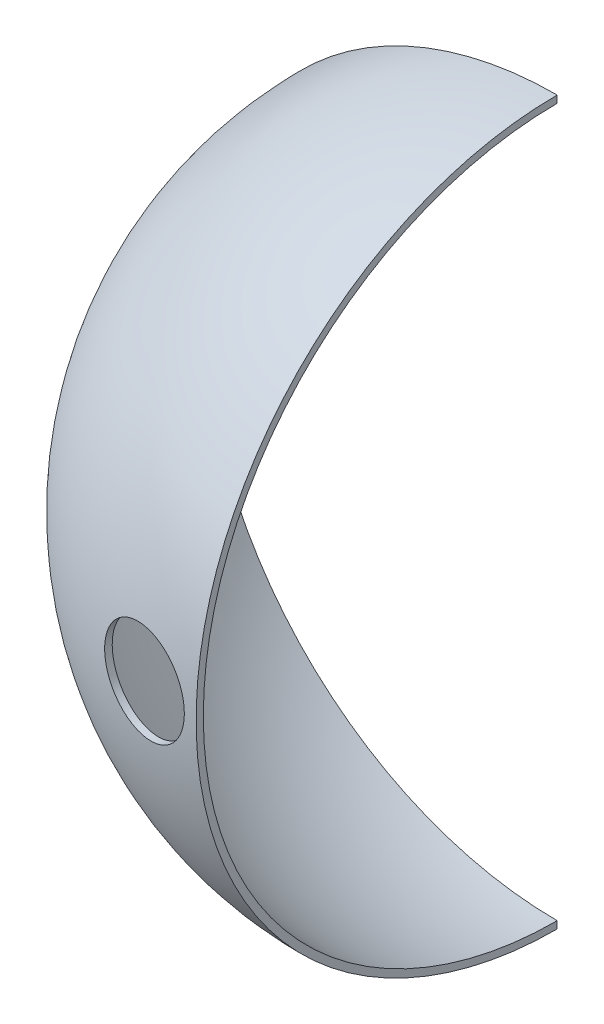
ISO-10303-21;
HEADER;
FILE_DESCRIPTION(('STEP AP214'),'2;1');
FILE_NAME('part.step','',(''),(''),'','','');
FILE_SCHEMA(('AUTOMOTIVE_DESIGN { 1 0 10303 214 1 1 1 1 }'));
ENDSEC;
DATA;
#1=APPLICATION_CONTEXT('core data for automotive mechanical design processes');
#2=APPLICATION_PROTOCOL_DEFINITION('international standard','automotive_design',2000,#1);
#3=PRODUCT_CONTEXT('',#1,'mechanical');
#4=PRODUCT('Part','Part','',(#3));
#5=PRODUCT_RELATED_PRODUCT_CATEGORY('part','',(#4));
#6=PRODUCT_DEFINITION_FORMATION('','',#4);
#7=PRODUCT_DEFINITION_CONTEXT('part definition',#1,'design');
#8=PRODUCT_DEFINITION('design','',#6,#7);
#9=PRODUCT_DEFINITION_SHAPE('','',#8);
#10=(LENGTH_UNIT() NAMED_UNIT(*) SI_UNIT(.MILLI.,.METRE.));
#11=(NAMED_UNIT(*) PLANE_ANGLE_UNIT() SI_UNIT($,.RADIAN.));
#12=(NAMED_UNIT(*) SI_UNIT($,.STERADIAN.) SOLID_ANGLE_UNIT());
#13=UNCERTAINTY_MEASURE_WITH_UNIT(LENGTH_MEASURE(1.E-05),#10,'distance_accuracy_value','');
#14=(GEOMETRIC_REPRESENTATION_CONTEXT(3) GLOBAL_UNCERTAINTY_ASSIGNED_CONTEXT((#13)) GLOBAL_UNIT_ASSIGNED_CONTEXT((#10,
#11,#12)) REPRESENTATION_CONTEXT('',''));
#15=CARTESIAN_POINT('',(0.,0.,0.));
#16=DIRECTION('',(0.,0.,1.));
#17=DIRECTION('',(1.,0.,0.));
#18=AXIS2_PLACEMENT_3D('',#15,#16,#17);
#19=CARTESIAN_POINT('',(0.,0.,0.));
#20=DIRECTION('',(0.,-1.,0.));
#21=DIRECTION('',(-1.,0.,0.));
#22=AXIS2_PLACEMENT_3D('',#19,#20,#21);
#23=SPHERICAL_SURFACE('',#22,150.5);
#24=CARTESIAN_POINT('',(0.,0.,0.));
#25=DIRECTION('',(1.,0.,0.));
#26=DIRECTION('',(0.,0.,-1.));
#27=AXIS2_PLACEMENT_3D('',#24,#25,#26);
#28=CIRCLE('',#27,150.5);
#29=CARTESIAN_POINT('',(0.,150.5,0.));
#30=VERTEX_POINT('',#29);
#31=CARTESIAN_POINT('',(0.,-150.5,0.));
#32=VERTEX_POINT('',#31);
#33=EDGE_CURVE('E50',#30,#32,#28,.T.);
#34=ORIENTED_EDGE('',*,*,#33,.F.);
#35=CARTESIAN_POINT('',(0.,0.,0.));
#36=DIRECTION('',(0.,0.,1.));
#37=DIRECTION('',(1.,0.,0.));
#38=AXIS2_PLACEMENT_3D('',#35,#36,#37);
#39=CIRCLE('',#38,150.5);
#40=EDGE_CURVE('E11',#32,#30,#39,.F.);
#41=ORIENTED_EDGE('',*,*,#40,.F.);
#42=EDGE_LOOP('',(#34,#41));
#43=FACE_BOUND('',#42,.T.);
#44=CARTESIAN_POINT('',(-39.4310487306858,-13.8471958364346,144.581110673095));
#45=CARTESIAN_POINT('',(-39.0381050233485,-14.2567071014734,144.649055865685));
#46=CARTESIAN_POINT('',(-38.6279701786542,-14.6492144025673,144.719925686218));
#47=CARTESIAN_POINT('',(-37.9893487706629,-15.2104314734974,144.830189927499));
#48=CARTESIAN_POINT('',(-37.7725268102766,-15.3929463833361,144.867612346065));
#49=CARTESIAN_POINT('',(-37.331403445921,-15.7485482130627,144.943717616003));
#50=CARTESIAN_POINT('',(-37.1071000890091,-15.9216326396705,144.982400796423));
#51=CARTESIAN_POINT('',(-36.4231935372251,-16.4265614154972,145.100298067775));
#52=CARTESIAN_POINT('',(-35.9529629320937,-16.7437570709808,145.181296155008));
#53=CARTESIAN_POINT('',(-34.9878040589899,-17.3367986437559,145.3474000197));
#54=CARTESIAN_POINT('',(-34.4928756176414,-17.6126442707202,145.432505825996));
#55=CARTESIAN_POINT('',(-33.7349930699175,-17.9938834878905,145.562708931914));
#56=CARTESIAN_POINT('',(-33.4798729584012,-18.1155059882787,145.606518760626));
#57=CARTESIAN_POINT('',(-32.9648920054357,-18.3477591601832,145.694911897753));
#58=CARTESIAN_POINT('',(-32.7050324058151,-18.4583926633953,145.739495003409));
#59=CARTESIAN_POINT('',(-31.9188753559008,-18.7735947314012,145.874309940598));
#60=CARTESIAN_POINT('',(-31.3859620113773,-18.9614837793332,145.96561386001));
#61=CARTESIAN_POINT('',(-30.3067202695832,-19.2913746895618,146.150342177875));
#62=CARTESIAN_POINT('',(-29.7603956179423,-19.4333892106913,146.243765983729));
#63=CARTESIAN_POINT('',(-28.6579314464045,-19.6707252715155,146.432108139113));
#64=CARTESIAN_POINT('',(-28.1017919095298,-19.766046730432,146.52702649123));
#65=CARTESIAN_POINT('',(-26.9789535329713,-19.9099667766591,146.718477236235));
#66=CARTESIAN_POINT('',(-26.4122053737911,-19.9581713697531,146.815016486435));
#67=CARTESIAN_POINT('',(-25.276685145813,-20.0061583357826,147.008248331118));
#68=CARTESIAN_POINT('',(-24.7079130637484,-20.005940390722,147.104940926604));
#69=CARTESIAN_POINT('',(-23.5723194321493,-19.9570725053761,147.297804900283));
#70=CARTESIAN_POINT('',(-23.0054980335153,-19.9084188991269,147.39397623847));
#71=CARTESIAN_POINT('',(-21.8778578192108,-19.7629807821317,147.585115248932));
#72=CARTESIAN_POINT('',(-21.3170390050038,-19.6661962596513,147.680082920913));
#73=CARTESIAN_POINT('',(-20.2035954922698,-19.4247280579177,147.868452095532));
#74=CARTESIAN_POINT('',(-19.6510029777789,-19.2798912101961,147.961847573358));
#75=CARTESIAN_POINT('',(-18.5598408596744,-18.943345138589,148.146098311688));
#76=CARTESIAN_POINT('',(-18.0212713080786,-18.7516357408587,148.236953562769));
#77=CARTESIAN_POINT('',(-16.9620700330992,-18.3226135802604,148.415479203055));
#78=CARTESIAN_POINT('',(-16.4414381081323,-18.0853013300751,148.503149628052));
#79=CARTESIAN_POINT('',(-15.4219237439402,-17.5666601403855,148.674682342639));
#80=CARTESIAN_POINT('',(-14.9230411696594,-17.2853314742571,148.758544655877));
#81=CARTESIAN_POINT('',(-13.9536034865514,-16.6823571503085,148.921376626357));
#82=CARTESIAN_POINT('',(-13.4828981243699,-16.3609601041686,149.000372315798));
#83=CARTESIAN_POINT('',(-12.5701250273682,-15.6787387057272,149.153443163449));
#84=CARTESIAN_POINT('',(-12.1280572300141,-15.3179144395247,149.227518332402));
#85=CARTESIAN_POINT('',(-11.2759035076325,-14.5593460700349,149.370210939332));
#86=CARTESIAN_POINT('',(-10.8658160929058,-14.1616036883471,149.43882863153));
#87=CARTESIAN_POINT('',(-10.0807279121524,-13.3319718294018,149.570110364453));
#88=CARTESIAN_POINT('',(-9.70572680842968,-12.9000826808711,149.632774462479));
#89=CARTESIAN_POINT('',(-8.99808317085398,-12.010729015796,149.750957564784));
#90=CARTESIAN_POINT('',(-8.66497681754641,-11.5536439176136,149.80655489597));
#91=CARTESIAN_POINT('',(-8.03836027368832,-10.6123714920214,149.911089380912));
#92=CARTESIAN_POINT('',(-7.7448497970045,-10.1281843604959,149.960026582797));
#93=CARTESIAN_POINT('',(-7.19970836366882,-9.13618683221437,150.050880192161));
#94=CARTESIAN_POINT('',(-6.9480749869838,-8.62837780271428,150.092797005343));
#95=CARTESIAN_POINT('',(-6.48863427681404,-7.59277414590212,150.169303622809));
#96=CARTESIAN_POINT('',(-6.28082656724651,-7.06497969013755,150.203893489968));
#97=CARTESIAN_POINT('',(-5.91311660191968,-6.00032254768558,150.265082750896));
#98=CARTESIAN_POINT('',(-5.75261886178398,-5.46367116725464,150.291781481993));
#99=CARTESIAN_POINT('',(-5.47713780883706,-4.37849486370027,150.337598873529));
#100=CARTESIAN_POINT('',(-5.36215408576806,-3.82997004764954,150.356717602292));
#101=CARTESIAN_POINT('',(-5.17860031419056,-2.72502321520955,150.387234223849));
#102=CARTESIAN_POINT('',(-5.11002807117031,-2.16860157348268,150.398632481695));
#103=CARTESIAN_POINT('',(-5.01982500858012,-1.05186183381576,150.413625732685));
#104=CARTESIAN_POINT('',(-4.99819400954645,-0.49154375078064,150.417220755663));
#105=CARTESIAN_POINT('',(-5.00202566307133,0.624193702103059,150.416583915192));
#106=CARTESIAN_POINT('',(-5.02709246340583,1.17961451116165,150.412417841726));
#107=CARTESIAN_POINT('',(-5.12335011988648,2.286330337298,150.396418035279));
#108=CARTESIAN_POINT('',(-5.19454066272231,2.8376253823756,150.384584354383));
#109=CARTESIAN_POINT('',(-5.38249673560425,3.93216188954608,150.353335203772));
#110=CARTESIAN_POINT('',(-5.49926153740148,4.47540348018427,150.333919855207));
#111=CARTESIAN_POINT('',(-5.77747236625919,5.54999740118211,150.287647251416));
#112=CARTESIAN_POINT('',(-5.93891848725989,6.08134970654259,150.260789980543));
#113=CARTESIAN_POINT('',(-6.3052153880688,7.12828969791958,150.19983408269));
#114=CARTESIAN_POINT('',(-6.51005483452217,7.64388146007652,150.165737346488));
#115=CARTESIAN_POINT('',(-6.96161730456683,8.65585055262194,150.090541165883));
#116=CARTESIAN_POINT('',(-7.20834025500981,9.15222791656595,150.04944173371));
#117=CARTESIAN_POINT('',(-7.74183099038647,10.1223539018057,149.960529559679));
#118=CARTESIAN_POINT('',(-8.02859952268348,10.596102100556,149.91271669253));
#119=CARTESIAN_POINT('',(-8.64005836104765,11.5177314144254,149.810712841488));
#120=CARTESIAN_POINT('',(-8.96474892049614,11.9656123566789,149.756521814978));
#121=CARTESIAN_POINT('',(-9.65239303165174,12.8359246891653,149.641684266774));
#122=CARTESIAN_POINT('',(-10.0156291881729,13.2581264951565,149.580990028834));
#123=CARTESIAN_POINT('',(-10.7755537634229,14.0703386398069,149.453927171228));
#124=CARTESIAN_POINT('',(-11.1722423110357,14.4603488544283,149.3875585297));
#125=CARTESIAN_POINT('',(-11.9962207277537,15.2056017337429,149.249602078489));
#126=CARTESIAN_POINT('',(-12.4235119780029,15.5608428275413,149.178014033244));
#127=CARTESIAN_POINT('',(-13.3056306445289,16.234211538865,149.030110835533));
#128=CARTESIAN_POINT('',(-13.760458294244,16.5523388416931,148.953795642991));
#129=CARTESIAN_POINT('',(-14.7004529103714,17.1532646166827,148.795946389675));
#130=CARTESIAN_POINT('',(-15.1859347520784,17.4355563095933,148.7143578473));
#131=CARTESIAN_POINT('',(-16.1783935840184,17.9581117912877,148.547424368978));
#132=CARTESIAN_POINT('',(-16.6853707417063,18.1983752525843,148.462079403767));
#133=CARTESIAN_POINT('',(-17.717269009037,18.6353369314422,148.288212971701));
#134=CARTESIAN_POINT('',(-18.2421910937533,18.832032777313,148.199691332222));
#135=CARTESIAN_POINT('',(-19.3062863492245,19.1805912575003,148.02007886502));
#136=CARTESIAN_POINT('',(-19.845459619941,19.3324535772519,147.928988019275));
#137=CARTESIAN_POINT('',(-20.9411660032572,19.592008934257,147.743698306312));
#138=CARTESIAN_POINT('',(-21.4978320989679,19.6991232482262,147.649474772249));
#139=CARTESIAN_POINT('',(-22.6180216240787,19.8657200168688,147.459682367447));
#140=CARTESIAN_POINT('',(-23.1815451126648,19.9252020601329,147.364113485095));
#141=CARTESIAN_POINT('',(-24.3115155850243,19.9961613351089,147.172291616602));
#142=CARTESIAN_POINT('',(-24.8779626932765,20.007636505671,147.076038601265));
#143=CARTESIAN_POINT('',(-26.0097885753122,19.9825110019982,146.883524728704));
#144=CARTESIAN_POINT('',(-26.5751673463872,19.9459102060395,146.78726387146));
#145=CARTESIAN_POINT('',(-27.7047969895775,19.8244546473739,146.594745745424));
#146=CARTESIAN_POINT('',(-28.26901295984,19.7392675981161,146.498493114458));
#147=CARTESIAN_POINT('',(-29.3883327565937,19.5209547214154,146.307356260794));
#148=CARTESIAN_POINT('',(-29.9434365285442,19.3878286071444,146.212472046287));
#149=CARTESIAN_POINT('',(-31.0405639810498,19.0745131417043,146.024760265136));
#150=CARTESIAN_POINT('',(-31.5825875450139,18.8943233712,145.931932716824));
#151=CARTESIAN_POINT('',(-32.6496422964996,18.4880740069558,145.749018008202));
#152=CARTESIAN_POINT('',(-33.1746735473683,18.2620145842402,145.658930837676));
#153=CARTESIAN_POINT('',(-34.2028872254465,17.7660353618938,145.482347449595));
#154=CARTESIAN_POINT('',(-34.7061116302177,17.4962050492197,145.395844348316));
#155=CARTESIAN_POINT('',(-35.6881506462644,16.9141722546992,145.226890089921));
#156=CARTESIAN_POINT('',(-36.1669652432696,16.601969748082,145.144438935173));
#157=CARTESIAN_POINT('',(-37.0966176069198,15.9373251578117,144.98422513472));
#158=CARTESIAN_POINT('',(-37.5474562090932,15.5848842768078,144.906462348994));
#159=CARTESIAN_POINT('',(-38.4177784452603,14.8421857323881,144.756232063961));
#160=CARTESIAN_POINT('',(-38.8372623636637,14.4519284120686,144.683764516623));
#161=CARTESIAN_POINT('',(-39.6374559823403,13.6406053127031,144.545432083404));
#162=CARTESIAN_POINT('',(-40.018526065361,13.2199053998091,144.479505943641));
#163=CARTESIAN_POINT('',(-40.7439422971293,12.3470760459321,144.353929038803));
#164=CARTESIAN_POINT('',(-41.0882886482598,11.8949467781774,144.294278239146));
#165=CARTESIAN_POINT('',(-41.737587538945,10.9624776730457,144.181738755819));
#166=CARTESIAN_POINT('',(-42.0425423976598,10.4821394988824,144.128849674057));
#167=CARTESIAN_POINT('',(-42.6106994180848,9.49667006674829,144.030265778563));
#168=CARTESIAN_POINT('',(-42.8739020115244,8.9915390652127,143.984570890441));
#169=CARTESIAN_POINT('',(-43.3530022190106,7.9675728419918,143.901360647171));
#170=CARTESIAN_POINT('',(-43.5695256925633,7.44903916868972,143.863737112402));
#171=CARTESIAN_POINT('',(-43.9583095066681,6.3951504160963,143.796160127523));
#172=CARTESIAN_POINT('',(-44.1305702525133,5.85979549087965,143.766206607182));
#173=CARTESIAN_POINT('',(-44.4294621729573,4.77617646044853,143.71422187005));
#174=CARTESIAN_POINT('',(-44.5560979092529,4.22791365163757,143.692189861248));
#175=CARTESIAN_POINT('',(-44.7627616389475,3.12241177170261,143.65622938826));
#176=CARTESIAN_POINT('',(-44.8427899806252,2.56517276768616,143.64230086352));
#177=CARTESIAN_POINT('',(-44.9549419804315,1.45236056964842,143.622780209533));
#178=CARTESIAN_POINT('',(-44.9876165620134,0.896844510990387,143.617092208598));
#179=CARTESIAN_POINT('',(-45.006571648817,-0.215001892260211,143.613792584322));
#180=CARTESIAN_POINT('',(-44.9928523710069,-0.771332233032496,143.616180923209));
#181=CARTESIAN_POINT('',(-44.9191181720854,-1.88095119540338,143.629015635625));
#182=CARTESIAN_POINT('',(-44.8590925392926,-2.43423908338713,143.639463873585));
#183=CARTESIAN_POINT('',(-44.6932014234012,-3.53367866811715,143.668333799473));
#184=CARTESIAN_POINT('',(-44.5873366771926,-4.07983047943455,143.686755359225));
#185=CARTESIAN_POINT('',(-44.3309634201012,-5.15953747358617,143.731354700457));
#186=CARTESIAN_POINT('',(-44.1805863077398,-5.69312481014475,143.757509653057));
#187=CARTESIAN_POINT('',(-43.836216951042,-6.74563195994952,143.817384373045));
#188=CARTESIAN_POINT('',(-43.6422218811212,-7.26455082051478,143.851104630515));
#189=CARTESIAN_POINT('',(-43.2123273508987,-8.28351019475595,143.925796938743));
#190=CARTESIAN_POINT('',(-42.9764747711589,-8.78357107748781,143.966760876368));
#191=CARTESIAN_POINT('',(-42.4645779841234,-9.76182672308232,144.055624928104));
#192=CARTESIAN_POINT('',(-42.188544458996,-10.2400272532926,144.103523198692));
#193=CARTESIAN_POINT('',(-41.5362035015163,-11.2693828566372,144.216655282135));
#194=CARTESIAN_POINT('',(-41.1510116555136,-11.8147695084078,144.283417240085));
#195=CARTESIAN_POINT('',(-40.3287720456123,-12.8636262686523,144.425816470732));
#196=CARTESIAN_POINT('',(-39.8917246032074,-13.3670966369652,144.501453688403));
#197=CARTESIAN_POINT('',(-39.4310487306858,-13.8471958364346,144.581110673095));
#198=B_SPLINE_CURVE_WITH_KNOTS('',3,(#44,#45,#46,#47,#48,#49,#50,#51,#52,#53,#54,#55,#56,#57,
#58,#59,#60,#61,#62,#63,#64,#65,#66,#67,#68,#69,#70,#71,#72,#73,#74,#75,#76,#77,#78,#79,#80,#81,
#82,#83,#84,#85,#86,#87,#88,#89,#90,#91,#92,#93,#94,#95,#96,#97,#98,#99,#100,#101,#102,#103,
#104,#105,#106,#107,#108,#109,#110,#111,#112,#113,#114,#115,#116,#117,#118,#119,#120,#121,#122,
#123,#124,#125,#126,#127,#128,#129,#130,#131,#132,#133,#134,#135,#136,#137,#138,#139,#140,#141,
#142,#143,#144,#145,#146,#147,#148,#149,#150,#151,#152,#153,#154,#155,#156,#157,#158,#159,#160,
#161,#162,#163,#164,#165,#166,#167,#168,#169,#170,#171,#172,#173,#174,#175,#176,#177,#178,#179,
#180,#181,#182,#183,#184,#185,#186,#187,#188,#189,#190,#191,#192,#193,#194,#195,#196,#197),
.UNSPECIFIED.,.T.,.F.,(4,2,2,2,2,2,2,2,2,2,2,2,2,2,2,2,2,2,2,2,2,2,2,2,2,2,2,2,2,2,2,2,2,2,2,2,
2,2,2,2,2,2,2,2,2,2,2,2,2,2,2,2,2,2,2,2,2,2,2,2,2,2,2,2,2,2,2,2,2,2,2,2,2,2,2,2,4),(0.,
1.71411743400882,2.57151361915008,3.42913539802371,5.14586015199941,6.86259695889199,
7.7203843425596,8.57795011101619,10.2929541753607,12.007484588329,13.722017967392,
15.4507687585125,17.1795309025339,18.9084239018239,20.6373173226251,22.3717754647753,
24.1062400399234,25.8406851167707,27.5751194217991,29.2992828743472,31.0234425618396,
32.7475218870874,34.4715846168477,36.1744651527161,37.8773333823306,39.5801031708007,
41.2828583466359,42.963163613039,44.6434537330314,46.3236643969476,48.003868637144,
49.6698947344959,51.335909514949,53.0018976745909,54.6678893369163,56.3334464151899,
57.9990005846467,59.6645858421897,61.3301822292105,63.0089665482541,64.6877573355418,
66.3666239368675,68.0455047726874,69.7459697929691,71.4464480628165,73.1470188788642,
74.8476016263168,76.5695437025943,78.2915006514678,80.0135315308948,81.7355667703487,
83.4695228857761,85.2034893759527,86.9374713162275,88.6714467914985,90.4019209304963,
92.1323960811357,93.8628195246682,95.5932272701019,97.3054945112341,99.0177523156554,
100.729909265515,102.442048510066,104.129565464732,105.817066967045,107.504399702098,
109.191719828217,110.859247218298,112.52676680994,114.194672251362,115.862550881247,
117.525554290972,119.18866546161,120.849925563573,122.510744820767,124.520339134723,
126.52992099027),.UNSPECIFIED.);
#199=CARTESIAN_POINT('',(-39.4310487306858,-13.8471958364346,144.581110673095));
#200=VERTEX_POINT('',#199);
#201=EDGE_CURVE('E85',#200,#200,#198,.T.);
#202=ORIENTED_EDGE('',*,*,#201,.F.);
#203=EDGE_LOOP('',(#202));
#204=FACE_BOUND('',#203,.T.);
#205=ADVANCED_FACE('F41',(#43,#204),#23,.T.);
#206=CARTESIAN_POINT('',(0.,0.,0.));
#207=DIRECTION('',(0.,-1.,0.));
#208=DIRECTION('',(1.,0.,0.));
#209=AXIS2_PLACEMENT_3D('',#206,#207,#208);
#210=SPHERICAL_SURFACE('',#209,147.5);
#211=CARTESIAN_POINT('',(0.,0.,0.));
#212=DIRECTION('',(0.,0.,1.));
#213=DIRECTION('',(1.,0.,0.));
#214=AXIS2_PLACEMENT_3D('',#211,#212,#213);
#215=CIRCLE('',#214,147.5);
#216=CARTESIAN_POINT('',(0.,147.5,0.));
#217=VERTEX_POINT('',#216);
#218=CARTESIAN_POINT('',(0.,-147.5,0.));
#219=VERTEX_POINT('',#218);
#220=EDGE_CURVE('E74',#217,#219,#215,.T.);
#221=ORIENTED_EDGE('',*,*,#220,.F.);
#222=CARTESIAN_POINT('',(0.,0.,0.));
#223=DIRECTION('',(1.,0.,0.));
#224=DIRECTION('',(0.,0.,-1.));
#225=AXIS2_PLACEMENT_3D('',#222,#223,#224);
#226=CIRCLE('',#225,147.5);
#227=EDGE_CURVE('E45',#217,#219,#226,.T.);
#228=ORIENTED_EDGE('',*,*,#227,.T.);
#229=EDGE_LOOP('',(#221,#228));
#230=FACE_BOUND('',#229,.T.);
#231=CARTESIAN_POINT('',(-39.4111654350206,-13.8678877556918,141.459152154426));
#232=CARTESIAN_POINT('',(-39.7964944031254,-13.4674720470211,141.391053196066));
#233=CARTESIAN_POINT('',(-40.1653049033994,-13.0507914810143,141.325824302509));
#234=CARTESIAN_POINT('',(-40.8674398644262,-12.1874483970025,141.201564676403));
#235=CARTESIAN_POINT('',(-41.2007563330377,-11.7407791632523,141.142535339842));
#236=CARTESIAN_POINT('',(-41.8295850590218,-10.8201726756964,141.031109532958));
#237=CARTESIAN_POINT('',(-42.1250608970304,-10.3462097798191,140.978719453028));
#238=CARTESIAN_POINT('',(-42.6755987525575,-9.37469506647189,140.881057803402));
#239=CARTESIAN_POINT('',(-42.9306630890697,-8.87714460469296,140.835785825239));
#240=CARTESIAN_POINT('',(-43.3984684593935,-7.86185778310957,140.752720412416));
#241=CARTESIAN_POINT('',(-43.6112047443883,-7.34411916616446,140.714927816877));
#242=CARTESIAN_POINT('',(-43.9926732023081,-6.29216930870728,140.647138221424));
#243=CARTESIAN_POINT('',(-44.1614047138351,-5.75795782074056,140.617141338682));
#244=CARTESIAN_POINT('',(-44.4535031567106,-4.67702613551699,140.565200236411));
#245=CARTESIAN_POINT('',(-44.5768809559058,-4.13030896832079,140.543254087735));
#246=CARTESIAN_POINT('',(-44.7773546656151,-3.02819217688646,140.507589066767));
#247=CARTESIAN_POINT('',(-44.8544510441954,-2.47279264051556,140.49387011127));
#248=CARTESIAN_POINT('',(-44.9613065435821,-1.36197844827483,140.474854556133));
#249=CARTESIAN_POINT('',(-44.9914537034805,-0.806602269857801,140.469488915792));
#250=CARTESIAN_POINT('',(-45.0053979618693,0.304748845005296,140.467007170909));
#251=CARTESIAN_POINT('',(-44.9891952829988,0.860723778562451,140.469891026741));
#252=CARTESIAN_POINT('',(-44.91056676384,1.96929187610464,140.483884166468));
#253=CARTESIAN_POINT('',(-44.8481407734881,2.52188502910487,140.494993477069));
#254=CARTESIAN_POINT('',(-44.6775528958112,3.61973853154358,140.52534499166));
#255=CARTESIAN_POINT('',(-44.5693910345773,4.16499888516503,140.544587191012));
#256=CARTESIAN_POINT('',(-44.3086163289992,5.2424740468459,140.590965992242));
#257=CARTESIAN_POINT('',(-44.1561556570853,5.77472686288055,140.618075568233));
#258=CARTESIAN_POINT('',(-43.8078131710135,6.82436321613488,140.679992532489));
#259=CARTESIAN_POINT('',(-43.6119315205351,7.34174680939718,140.714799891736));
#260=CARTESIAN_POINT('',(-43.1782320210091,8.35805785774741,140.791831727921));
#261=CARTESIAN_POINT('',(-42.9404137701448,8.85698513594026,140.834056275926));
#262=CARTESIAN_POINT('',(-42.4246272994401,9.83295521031666,140.925585782776));
#263=CARTESIAN_POINT('',(-42.1466588175518,10.3099978636394,140.974890787833));
#264=CARTESIAN_POINT('',(-41.5506271809192,11.2421001815807,141.080549507619));
#265=CARTESIAN_POINT('',(-41.2323061654734,11.6969898144536,141.136948534761));
#266=CARTESIAN_POINT('',(-40.5594180161279,12.5782295163994,141.256088882679));
#267=CARTESIAN_POINT('',(-40.2048507804033,13.0045795052914,141.318830221273));
#268=CARTESIAN_POINT('',(-39.4620421443944,13.8259155365305,141.450175696137));
#269=CARTESIAN_POINT('',(-39.0737992401114,14.22090017655,141.518780094257));
#270=CARTESIAN_POINT('',(-38.266443874084,14.9768926588143,141.661331651934));
#271=CARTESIAN_POINT('',(-37.8473311229069,15.3379001824206,141.735278861584));
#272=CARTESIAN_POINT('',(-36.9752878141759,16.0282861624834,141.889011542705));
#273=CARTESIAN_POINT('',(-36.5219736423836,16.3571654490309,141.968862944007));
#274=CARTESIAN_POINT('',(-35.5899291823935,16.9754575120826,142.132896497094));
#275=CARTESIAN_POINT('',(-35.1111986895705,17.264869970775,142.217078683745));
#276=CARTESIAN_POINT('',(-34.13168020441,17.8023741734774,142.389161779463));
#277=CARTESIAN_POINT('',(-33.6308908709999,18.0504634008353,142.477062914612));
#278=CARTESIAN_POINT('',(-32.6107812677131,18.5037167450617,142.655946023556));
#279=CARTESIAN_POINT('',(-32.0914608456838,18.7088805093884,142.746928022647));
#280=CARTESIAN_POINT('',(-31.0302985255174,19.0776183376015,142.932654840045));
#281=CARTESIAN_POINT('',(-30.4882401480481,19.2405518676708,143.027434955223));
#282=CARTESIAN_POINT('',(-29.3925723883397,19.519860199552,143.218820472457));
#283=CARTESIAN_POINT('',(-28.8389628947206,19.6362345522045,143.315425892112));
#284=CARTESIAN_POINT('',(-27.724046908579,19.8216784985681,143.509780496151));
#285=CARTESIAN_POINT('',(-27.1627400437774,19.8907457960112,143.607529735821));
#286=CARTESIAN_POINT('',(-26.0363729020344,19.9811199285818,143.803480327161));
#287=CARTESIAN_POINT('',(-25.471312611555,20.0024265913505,143.901681680461));
#288=CARTESIAN_POINT('',(-24.3363897918576,19.9971114852277,144.098717208848));
#289=CARTESIAN_POINT('',(-23.7665288439815,19.9700655200686,144.197549330427));
#290=CARTESIAN_POINT('',(-22.6310349055797,19.8673848634785,144.394279426124));
#291=CARTESIAN_POINT('',(-22.0654019452579,19.7917498252698,144.49217739357));
#292=CARTESIAN_POINT('',(-20.9423847101412,19.5923707380182,144.686351087471));
#293=CARTESIAN_POINT('',(-20.3850005686071,19.4686259126326,144.782626787722));
#294=CARTESIAN_POINT('',(-19.2824839643463,19.173826443853,144.97287626047));
#295=CARTESIAN_POINT('',(-18.7373514669108,19.0027719345049,145.066850039487));
#296=CARTESIAN_POINT('',(-17.6635183944346,18.6145599690496,145.251790446904));
#297=CARTESIAN_POINT('',(-17.1348103891856,18.3974237183774,145.3427584363));
#298=CARTESIAN_POINT('',(-16.0974143844979,17.9184366453771,145.521088616987));
#299=CARTESIAN_POINT('',(-15.5887264174258,17.656585750762,145.608450802447));
#300=CARTESIAN_POINT('',(-14.5951322571437,17.0899326787273,145.77894448524));
#301=CARTESIAN_POINT('',(-14.1102254576177,16.785131597118,145.862076090436));
#302=CARTESIAN_POINT('',(-13.167800423037,16.1346480515967,146.023513502375));
#303=CARTESIAN_POINT('',(-12.7102819584976,15.788965930296,146.101819349554));
#304=CARTESIAN_POINT('',(-11.8302144601993,15.0625122491577,146.252332935988));
#305=CARTESIAN_POINT('',(-11.4073793004464,14.682097674353,146.324590699363));
#306=CARTESIAN_POINT('',(-10.5951660128817,13.8861107235817,146.463294071633));
#307=CARTESIAN_POINT('',(-10.2057877311399,13.4705385093874,146.52973970727));
#308=CARTESIAN_POINT('',(-9.46348171085977,12.6071681347743,146.65633270375));
#309=CARTESIAN_POINT('',(-9.11055194591107,12.1593717682572,146.71648041474));
#310=CARTESIAN_POINT('',(-8.44385197125164,11.2347149809531,146.830039933048));
#311=CARTESIAN_POINT('',(-8.13008136233046,10.7578548565322,146.883451809035));
#312=CARTESIAN_POINT('',(-7.5482376672416,9.78532596328881,146.982449747256));
#313=CARTESIAN_POINT('',(-7.27958946784579,9.29001123834088,147.028134361419));
#314=CARTESIAN_POINT('',(-6.78483345704499,8.277979548287,147.11223639295));
#315=CARTESIAN_POINT('',(-6.55872527326862,7.76126277057088,147.15065387393));
#316=CARTESIAN_POINT('',(-6.15082425095817,6.71016781921004,147.219937468984));
#317=CARTESIAN_POINT('',(-5.96902876372571,6.17579070334423,147.250804034399));
#318=CARTESIAN_POINT('',(-5.65116704138082,5.09322123035032,147.304760196698));
#319=CARTESIAN_POINT('',(-5.51510047035142,4.54502897473773,147.327849850711));
#320=CARTESIAN_POINT('',(-5.29117286087877,3.44570557828484,147.365843103392));
#321=CARTESIAN_POINT('',(-5.20273449249972,2.89469535522155,147.380844744292));
#322=CARTESIAN_POINT('',(-5.07219558915308,1.78705858775135,147.402986209582));
#323=CARTESIAN_POINT('',(-5.03009463940064,1.23043209366295,147.410126104347));
#324=CARTESIAN_POINT('',(-4.99255876646709,0.115583988296139,147.416491858505));
#325=CARTESIAN_POINT('',(-4.99712210125992,-0.442637562659396,147.415718013326));
#326=CARTESIAN_POINT('',(-5.05287501808583,-1.55667977976653,147.406262659884));
#327=CARTESIAN_POINT('',(-5.10406452787964,-2.11250044963655,147.397581163873));
#328=CARTESIAN_POINT('',(-5.25224663536538,-3.21459495502011,147.372445948258));
#329=CARTESIAN_POINT('',(-5.34897665846169,-3.76090513736913,147.356036784197));
#330=CARTESIAN_POINT('',(-5.58739474868694,-4.84333342044527,147.315581902253));
#331=CARTESIAN_POINT('',(-5.7290825798724,-5.37945157464563,147.291536224446));
#332=CARTESIAN_POINT('',(-6.05633414790974,-6.43772344016725,147.235980872381));
#333=CARTESIAN_POINT('',(-6.24189773842487,-6.95987719805684,147.204471223016));
#334=CARTESIAN_POINT('',(-6.65549531942474,-7.98657917448587,147.134212429375));
#335=CARTESIAN_POINT('',(-6.88352949316778,-8.49112731704686,147.095463253861));
#336=CARTESIAN_POINT('',(-7.38116383627524,-9.48073570241705,147.010862191662));
#337=CARTESIAN_POINT('',(-7.65089668882858,-9.96572727894789,146.96498763006));
#338=CARTESIAN_POINT('',(-8.22936837125886,-10.9111424009183,146.866551681156));
#339=CARTESIAN_POINT('',(-8.53810722182233,-11.3715659333281,146.81399029031));
#340=CARTESIAN_POINT('',(-9.19232076918164,-12.264735011545,146.702546213001));
#341=CARTESIAN_POINT('',(-9.537796693395,-12.6974796318014,146.643663315332));
#342=CARTESIAN_POINT('',(-10.262956495674,-13.5323791564687,146.519984978754));
#343=CARTESIAN_POINT('',(-10.6426406490609,-13.9345338146315,146.455189492258));
#344=CARTESIAN_POINT('',(-11.4377526270138,-14.7097604824986,146.319400718188));
#345=CARTESIAN_POINT('',(-11.8535218491963,-15.0824719688988,146.248348112676));
#346=CARTESIAN_POINT('',(-12.7142023174144,-15.7914546672532,146.101147497196));
#347=CARTESIAN_POINT('',(-13.1591137357891,-16.1277256636771,146.024999457094));
#348=CARTESIAN_POINT('',(-14.0749200447117,-16.7616462076965,145.868125884956));
#349=CARTESIAN_POINT('',(-14.5458163661021,-17.0592936254781,145.787400100841));
#350=CARTESIAN_POINT('',(-15.5102459173206,-17.6140296700676,145.621923311541));
#351=CARTESIAN_POINT('',(-16.0037793418083,-17.8711179480172,145.537172271742));
#352=CARTESIAN_POINT('',(-17.017081538001,-18.3464039844741,145.363006335012));
#353=CARTESIAN_POINT('',(-17.5371206599785,-18.5640076728686,145.273542794404));
#354=CARTESIAN_POINT('',(-18.5932481171129,-18.9544321899599,145.09168088484));
#355=CARTESIAN_POINT('',(-19.1293365977269,-19.1272526126439,144.999282489284));
#356=CARTESIAN_POINT('',(-20.2138068975505,-19.4270131622054,144.812183209491));
#357=CARTESIAN_POINT('',(-20.7621889236631,-19.5539525162777,144.717482286499));
#358=CARTESIAN_POINT('',(-21.8674161775734,-19.7611499131501,144.526427744259));
#359=CARTESIAN_POINT('',(-22.4242614464484,-19.8414077293019,144.430074116989));
#360=CARTESIAN_POINT('',(-23.5488901244412,-19.9553827382228,144.235276841648));
#361=CARTESIAN_POINT('',(-24.116726030982,-19.9885637741415,144.136821879736));
#362=CARTESIAN_POINT('',(-25.2530900259611,-20.0064717702761,143.939588807275));
#363=CARTESIAN_POINT('',(-25.8216181226908,-19.9911981442464,143.84081069283));
#364=CARTESIAN_POINT('',(-26.9556078425299,-19.9122730819706,143.64358436815));
#365=CARTESIAN_POINT('',(-27.5210685539301,-19.8486079793796,143.545136259003));
#366=CARTESIAN_POINT('',(-28.3636062325366,-19.7171758073196,143.39829876886));
#367=CARTESIAN_POINT('',(-28.643520501328,-19.667373402501,143.349490198585));
#368=CARTESIAN_POINT('',(-29.2011054118404,-19.555857523639,143.252214975487));
#369=CARTESIAN_POINT('',(-29.4787754532607,-19.4941409658586,143.203748414562));
#370=CARTESIAN_POINT('',(-30.3098514004362,-19.2907128720566,143.058613188879));
#371=CARTESIAN_POINT('',(-30.8590852408887,-19.1310717561099,142.962599017717));
#372=CARTESIAN_POINT('',(-31.9422479886385,-18.765179609251,142.773059724996));
#373=CARTESIAN_POINT('',(-32.4761769086156,-18.5589286169548,142.679534601376));
#374=CARTESIAN_POINT('',(-33.2623313152315,-18.2158066546791,142.541697574792));
#375=CARTESIAN_POINT('',(-33.5218379625806,-18.0958563417606,142.496175859801));
#376=CARTESIAN_POINT('',(-34.0355270813304,-17.8449134430309,142.406024018703));
#377=CARTESIAN_POINT('',(-34.2897109829249,-17.7139238722009,142.361393653247));
#378=CARTESIAN_POINT('',(-35.0435759035527,-17.3047227703415,142.228966782489));
#379=CARTESIAN_POINT('',(-35.5347539833331,-17.0101986015701,142.142602265471));
#380=CARTESIAN_POINT('',(-36.6279482650756,-16.2890753520906,141.950217702034));
#381=CARTESIAN_POINT('',(-37.221271097052,-15.8488404029954,141.845678332194));
#382=CARTESIAN_POINT('',(-38.3565320015381,-14.9046307612632,141.645449730292));
#383=CARTESIAN_POINT('',(-38.898470315425,-14.4006563680664,141.549760456658));
#384=CARTESIAN_POINT('',(-39.4111654350206,-13.8678877556918,141.459152154426));
#385=B_SPLINE_CURVE_WITH_KNOTS('',3,(#231,#232,#233,#234,#235,#236,#237,#238,#239,#240,#241,
#242,#243,#244,#245,#246,#247,#248,#249,#250,#251,#252,#253,#254,#255,#256,#257,#258,#259,#260,
#261,#262,#263,#264,#265,#266,#267,#268,#269,#270,#271,#272,#273,#274,#275,#276,#277,#278,#279,
#280,#281,#282,#283,#284,#285,#286,#287,#288,#289,#290,#291,#292,#293,#294,#295,#296,#297,#298,
#299,#300,#301,#302,#303,#304,#305,#306,#307,#308,#309,#310,#311,#312,#313,#314,#315,#316,#317,
#318,#319,#320,#321,#322,#323,#324,#325,#326,#327,#328,#329,#330,#331,#332,#333,#334,#335,#336,
#337,#338,#339,#340,#341,#342,#343,#344,#345,#346,#347,#348,#349,#350,#351,#352,#353,#354,#355,
#356,#357,#358,#359,#360,#361,#362,#363,#364,#365,#366,#367,#368,#369,#370,#371,#372,#373,#374,
#375,#376,#377,#378,#379,#380,#381,#382,#383,#384),.UNSPECIFIED.,.T.,.F.,(4,2,2,2,2,2,2,2,2,2,2,
2,2,2,2,2,2,2,2,2,2,2,2,2,2,2,2,2,2,2,2,2,2,2,2,2,2,2,2,2,2,2,2,2,2,2,2,2,2,2,2,2,2,2,2,2,2,2,2,
2,2,2,2,2,2,2,2,2,2,2,2,2,2,2,2,2,4),(0.,1.67895686435891,3.35829098123969,5.03922940170529,
6.72007132740522,8.40110172186318,10.0821573809911,11.7628099555229,13.4434455325263,
15.1101153761922,16.7767772141103,18.443444462856,20.1101107608132,21.7711181857291,
23.4321193494288,25.0931364289209,26.7541643498386,28.4263990263066,30.0986384006433,
31.7709524978372,33.4432822764837,35.1384461819353,36.833623737108,38.5289044936363,
40.2241991727559,41.9438739477805,43.6635653122163,45.3833401439564,47.1031211820205,
48.8380639243887,50.5730190490952,52.3080021717579,54.0429803786153,55.7771619250105,
57.5113462749576,59.2454863877674,60.9796119683206,62.6975786430578,64.415537413275,
66.1334006195001,67.8512463114308,69.5451887971775,71.2391164544144,72.9329428358397,
74.6267567744274,76.2995484178481,77.9723250873173,79.6450393105296,81.3177509421618,
82.9809341090115,84.6441085474392,86.3072774388385,87.9704535068894,89.6390349931797,
91.3076173643932,92.9762555019192,94.6449070705003,96.3315590160727,98.0182209369464,
99.7049758256621,101.391745221738,103.102100603602,104.812471491293,106.522871186546,
108.233279186067,109.963014784866,111.692771311552,113.423016524224,114.288205374718,
115.153618462787,116.891317010374,118.629014118291,119.497254604579,120.365258725551,
122.100659496958,124.334587141617,126.568504291948),.UNSPECIFIED.);
#386=CARTESIAN_POINT('',(-39.4111654350206,-13.8678877556918,141.459152154426));
#387=VERTEX_POINT('',#386);
#388=EDGE_CURVE('E83',#387,#387,#385,.T.);
#389=ORIENTED_EDGE('',*,*,#388,.F.);
#390=EDGE_LOOP('',(#389));
#391=FACE_BOUND('',#390,.T.);
#392=ADVANCED_FACE('F77',(#230,#391),#210,.F.);
#393=CARTESIAN_POINT('',(0.,0.,0.));
#394=DIRECTION('',(0.,0.,1.));
#395=DIRECTION('',(1.,0.,0.));
#396=AXIS2_PLACEMENT_3D('',#393,#394,#395);
#397=PLANE('',#396);
#398=ORIENTED_EDGE('',*,*,#220,.T.);
#399=DIRECTION('',(0.,1.,0.));
#400=VECTOR('',#399,1.);
#401=CARTESIAN_POINT('',(0.,0.,0.));
#402=LINE('',#401,#400);
#403=EDGE_CURVE('E68',#32,#219,#402,.T.);
#404=ORIENTED_EDGE('',*,*,#403,.F.);
#405=ORIENTED_EDGE('',*,*,#40,.T.);
#406=EDGE_CURVE('E63',#217,#30,#402,.T.);
#407=ORIENTED_EDGE('',*,*,#406,.F.);
#408=EDGE_LOOP('',(#398,#404,#405,#407));
#409=FACE_BOUND('',#408,.T.);
#410=ADVANCED_FACE('F75',(#409),#397,.F.);
#411=CARTESIAN_POINT('',(0.,0.,0.));
#412=DIRECTION('',(1.,0.,0.));
#413=DIRECTION('',(0.,0.,-1.));
#414=AXIS2_PLACEMENT_3D('',#411,#412,#413);
#415=PLANE('',#414);
#416=ORIENTED_EDGE('',*,*,#227,.F.);
#417=ORIENTED_EDGE('',*,*,#406,.T.);
#418=ORIENTED_EDGE('',*,*,#33,.T.);
#419=ORIENTED_EDGE('',*,*,#403,.T.);
#420=EDGE_LOOP('',(#416,#417,#418,#419));
#421=FACE_BOUND('',#420,.T.);
#422=ADVANCED_FACE('F43',(#421),#415,.T.);
#423=CARTESIAN_POINT('',(-25.,0.,150.501));
#424=DIRECTION('',(0.,0.,-1.));
#425=DIRECTION('',(-1.,0.,0.));
#426=AXIS2_PLACEMENT_3D('',#423,#424,#425);
#427=CYLINDRICAL_SURFACE('',#426,20.);
#428=ORIENTED_EDGE('',*,*,#201,.T.);
#429=EDGE_LOOP('',(#428));
#430=FACE_BOUND('',#429,.T.);
#431=ORIENTED_EDGE('',*,*,#388,.T.);
#432=EDGE_LOOP('',(#431));
#433=FACE_BOUND('',#432,.T.);
#434=ADVANCED_FACE('F98',(#430,#433),#427,.F.);
#435=CLOSED_SHELL('',(#205,#392,#410,#422,#434));
#436=MANIFOLD_SOLID_BREP('B2',#435);
#437=ADVANCED_BREP_SHAPE_REPRESENTATION('',(#18,#436),#14);
#438=SHAPE_DEFINITION_REPRESENTATION(#9,#437);
ENDSEC;
END-ISO-10303-21;
